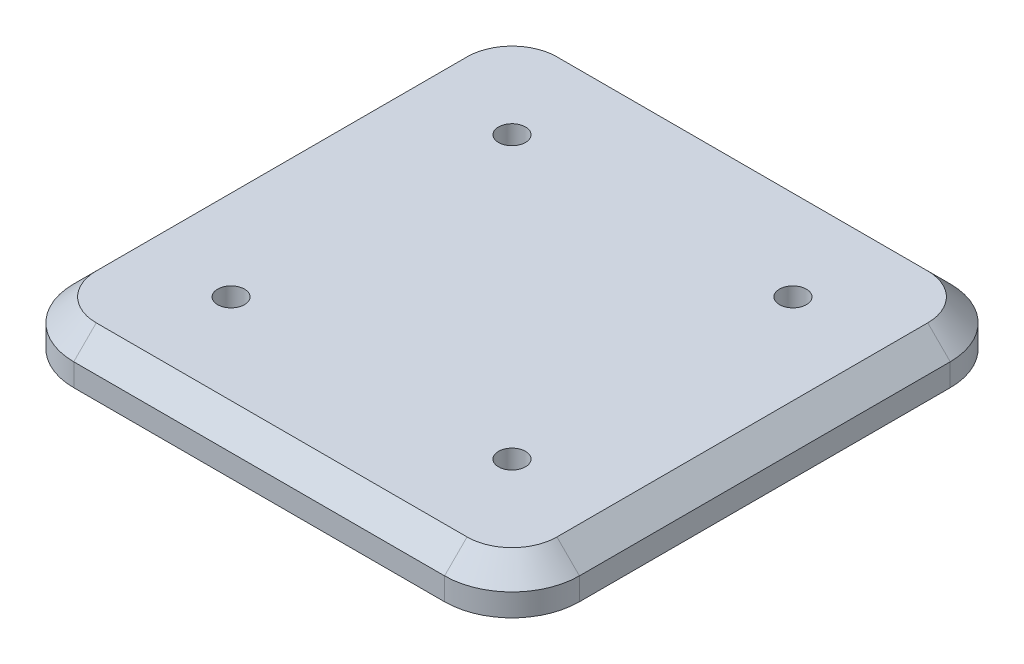
ISO-10303-21;
HEADER;
FILE_DESCRIPTION(('STEP AP214'),'2;1');
FILE_NAME('part.step','',(''),(''),'','','');
FILE_SCHEMA(('AUTOMOTIVE_DESIGN { 1 0 10303 214 1 1 1 1 }'));
ENDSEC;
DATA;
#1=APPLICATION_CONTEXT('core data for automotive mechanical design processes');
#2=APPLICATION_PROTOCOL_DEFINITION('international standard','automotive_design',2000,#1);
#3=PRODUCT_CONTEXT('',#1,'mechanical');
#4=PRODUCT('Part','Part','',(#3));
#5=PRODUCT_RELATED_PRODUCT_CATEGORY('part','',(#4));
#6=PRODUCT_DEFINITION_FORMATION('','',#4);
#7=PRODUCT_DEFINITION_CONTEXT('part definition',#1,'design');
#8=PRODUCT_DEFINITION('design','',#6,#7);
#9=PRODUCT_DEFINITION_SHAPE('','',#8);
#10=(LENGTH_UNIT() NAMED_UNIT(*) SI_UNIT(.MILLI.,.METRE.));
#11=(NAMED_UNIT(*) PLANE_ANGLE_UNIT() SI_UNIT($,.RADIAN.));
#12=(NAMED_UNIT(*) SI_UNIT($,.STERADIAN.) SOLID_ANGLE_UNIT());
#13=UNCERTAINTY_MEASURE_WITH_UNIT(LENGTH_MEASURE(1.E-05),#10,'distance_accuracy_value','');
#14=(GEOMETRIC_REPRESENTATION_CONTEXT(3) GLOBAL_UNCERTAINTY_ASSIGNED_CONTEXT((#13)) GLOBAL_UNIT_ASSIGNED_CONTEXT((#10,
#11,#12)) REPRESENTATION_CONTEXT('',''));
#15=CARTESIAN_POINT('',(0.,0.,0.));
#16=DIRECTION('',(0.,0.,1.));
#17=DIRECTION('',(1.,0.,0.));
#18=AXIS2_PLACEMENT_3D('',#15,#16,#17);
#19=CARTESIAN_POINT('',(0.,20.,0.));
#20=DIRECTION('',(1.,0.,0.));
#21=DIRECTION('',(0.,0.,-1.));
#22=AXIS2_PLACEMENT_3D('',#19,#20,#21);
#23=PLANE('',#22);
#24=DIRECTION('',(0.,-1.,0.));
#25=VECTOR('',#24,1.);
#26=CARTESIAN_POINT('',(0.,20.,-30.));
#27=LINE('',#26,#25);
#28=CARTESIAN_POINT('',(0.,0.,-30.));
#29=VERTEX_POINT('',#28);
#30=CARTESIAN_POINT('',(0.,10.,-30.));
#31=VERTEX_POINT('',#30);
#32=EDGE_CURVE('E217',#29,#31,#27,.F.);
#33=ORIENTED_EDGE('',*,*,#32,.T.);
#34=DIRECTION('',(0.,0.,-1.));
#35=VECTOR('',#34,1.);
#36=CARTESIAN_POINT('',(0.,10.,0.));
#37=LINE('',#36,#35);
#38=CARTESIAN_POINT('',(0.,10.,-195.));
#39=VERTEX_POINT('',#38);
#40=EDGE_CURVE('E261',#31,#39,#37,.T.);
#41=ORIENTED_EDGE('',*,*,#40,.T.);
#42=DIRECTION('',(0.,-1.,0.));
#43=VECTOR('',#42,1.);
#44=CARTESIAN_POINT('',(0.,20.,-195.));
#45=LINE('',#44,#43);
#46=CARTESIAN_POINT('',(0.,0.,-195.));
#47=VERTEX_POINT('',#46);
#48=EDGE_CURVE('E220',#39,#47,#45,.T.);
#49=ORIENTED_EDGE('',*,*,#48,.T.);
#50=DIRECTION('',(0.,0.,1.));
#51=VECTOR('',#50,1.);
#52=CARTESIAN_POINT('',(0.,0.,0.));
#53=LINE('',#52,#51);
#54=EDGE_CURVE('E205',#47,#29,#53,.T.);
#55=ORIENTED_EDGE('',*,*,#54,.T.);
#56=EDGE_LOOP('',(#33,#41,#49,#55));
#57=FACE_BOUND('',#56,.T.);
#58=ADVANCED_FACE('F35',(#57),#23,.F.);
#59=CARTESIAN_POINT('',(0.,20.,0.));
#60=DIRECTION('',(0.,0.,-1.));
#61=DIRECTION('',(-1.,0.,0.));
#62=AXIS2_PLACEMENT_3D('',#59,#60,#61);
#63=PLANE('',#62);
#64=DIRECTION('',(0.,-1.,0.));
#65=VECTOR('',#64,1.);
#66=CARTESIAN_POINT('',(195.,20.,0.));
#67=LINE('',#66,#65);
#68=CARTESIAN_POINT('',(195.,0.,0.));
#69=VERTEX_POINT('',#68);
#70=CARTESIAN_POINT('',(195.,10.,0.));
#71=VERTEX_POINT('',#70);
#72=EDGE_CURVE('E241',#69,#71,#67,.F.);
#73=ORIENTED_EDGE('',*,*,#72,.T.);
#74=DIRECTION('',(-1.,0.,0.));
#75=VECTOR('',#74,1.);
#76=CARTESIAN_POINT('',(0.,10.,0.));
#77=LINE('',#76,#75);
#78=CARTESIAN_POINT('',(30.,10.,0.));
#79=VERTEX_POINT('',#78);
#80=EDGE_CURVE('E268',#71,#79,#77,.T.);
#81=ORIENTED_EDGE('',*,*,#80,.T.);
#82=DIRECTION('',(0.,-1.,0.));
#83=VECTOR('',#82,1.);
#84=CARTESIAN_POINT('',(30.,20.,0.));
#85=LINE('',#84,#83);
#86=CARTESIAN_POINT('',(30.,0.,0.));
#87=VERTEX_POINT('',#86);
#88=EDGE_CURVE('E239',#79,#87,#85,.T.);
#89=ORIENTED_EDGE('',*,*,#88,.T.);
#90=DIRECTION('',(1.,0.,0.));
#91=VECTOR('',#90,1.);
#92=CARTESIAN_POINT('',(0.,0.,0.));
#93=LINE('',#92,#91);
#94=EDGE_CURVE('E208',#87,#69,#93,.T.);
#95=ORIENTED_EDGE('',*,*,#94,.T.);
#96=EDGE_LOOP('',(#73,#81,#89,#95));
#97=FACE_BOUND('',#96,.T.);
#98=ADVANCED_FACE('F311',(#97),#63,.F.);
#99=CARTESIAN_POINT('',(225.,20.,0.));
#100=DIRECTION('',(-1.,0.,0.));
#101=DIRECTION('',(0.,0.,1.));
#102=AXIS2_PLACEMENT_3D('',#99,#100,#101);
#103=PLANE('',#102);
#104=DIRECTION('',(0.,-1.,0.));
#105=VECTOR('',#104,1.);
#106=CARTESIAN_POINT('',(225.,20.,-195.));
#107=LINE('',#106,#105);
#108=CARTESIAN_POINT('',(225.,0.,-195.));
#109=VERTEX_POINT('',#108);
#110=CARTESIAN_POINT('',(225.,10.,-195.));
#111=VERTEX_POINT('',#110);
#112=EDGE_CURVE('E237',#109,#111,#107,.F.);
#113=ORIENTED_EDGE('',*,*,#112,.T.);
#114=DIRECTION('',(0.,0.,1.));
#115=VECTOR('',#114,1.);
#116=CARTESIAN_POINT('',(225.,10.,0.));
#117=LINE('',#116,#115);
#118=CARTESIAN_POINT('',(225.,10.,-30.));
#119=VERTEX_POINT('',#118);
#120=EDGE_CURVE('E11',#111,#119,#117,.T.);
#121=ORIENTED_EDGE('',*,*,#120,.T.);
#122=DIRECTION('',(0.,-1.,0.));
#123=VECTOR('',#122,1.);
#124=CARTESIAN_POINT('',(225.,20.,-30.));
#125=LINE('',#124,#123);
#126=CARTESIAN_POINT('',(225.,0.,-30.));
#127=VERTEX_POINT('',#126);
#128=EDGE_CURVE('E235',#119,#127,#125,.T.);
#129=ORIENTED_EDGE('',*,*,#128,.T.);
#130=DIRECTION('',(0.,0.,-1.));
#131=VECTOR('',#130,1.);
#132=CARTESIAN_POINT('',(225.,0.,0.));
#133=LINE('',#132,#131);
#134=EDGE_CURVE('E211',#127,#109,#133,.T.);
#135=ORIENTED_EDGE('',*,*,#134,.T.);
#136=EDGE_LOOP('',(#113,#121,#129,#135));
#137=FACE_BOUND('',#136,.T.);
#138=ADVANCED_FACE('F321',(#137),#103,.F.);
#139=CARTESIAN_POINT('',(0.,20.,-225.));
#140=DIRECTION('',(0.,0.,1.));
#141=DIRECTION('',(1.,0.,0.));
#142=AXIS2_PLACEMENT_3D('',#139,#140,#141);
#143=PLANE('',#142);
#144=DIRECTION('',(0.,-1.,0.));
#145=VECTOR('',#144,1.);
#146=CARTESIAN_POINT('',(30.,20.,-225.));
#147=LINE('',#146,#145);
#148=CARTESIAN_POINT('',(30.,0.,-225.));
#149=VERTEX_POINT('',#148);
#150=CARTESIAN_POINT('',(30.,10.,-225.));
#151=VERTEX_POINT('',#150);
#152=EDGE_CURVE('E232',#149,#151,#147,.F.);
#153=ORIENTED_EDGE('',*,*,#152,.T.);
#154=DIRECTION('',(1.,0.,0.));
#155=VECTOR('',#154,1.);
#156=CARTESIAN_POINT('',(0.,10.,-225.));
#157=LINE('',#156,#155);
#158=CARTESIAN_POINT('',(195.,10.,-225.));
#159=VERTEX_POINT('',#158);
#160=EDGE_CURVE('E270',#151,#159,#157,.T.);
#161=ORIENTED_EDGE('',*,*,#160,.T.);
#162=DIRECTION('',(0.,-1.,0.));
#163=VECTOR('',#162,1.);
#164=CARTESIAN_POINT('',(195.,20.,-225.));
#165=LINE('',#164,#163);
#166=CARTESIAN_POINT('',(195.,0.,-225.));
#167=VERTEX_POINT('',#166);
#168=EDGE_CURVE('E230',#159,#167,#165,.T.);
#169=ORIENTED_EDGE('',*,*,#168,.T.);
#170=DIRECTION('',(-1.,0.,0.));
#171=VECTOR('',#170,1.);
#172=CARTESIAN_POINT('',(0.,0.,-225.));
#173=LINE('',#172,#171);
#174=EDGE_CURVE('E214',#167,#149,#173,.T.);
#175=ORIENTED_EDGE('',*,*,#174,.T.);
#176=EDGE_LOOP('',(#153,#161,#169,#175));
#177=FACE_BOUND('',#176,.T.);
#178=ADVANCED_FACE('F326',(#177),#143,.F.);
#179=CARTESIAN_POINT('',(0.,20.,0.));
#180=DIRECTION('',(0.,-1.,0.));
#181=DIRECTION('',(0.,0.,-1.));
#182=AXIS2_PLACEMENT_3D('',#179,#180,#181);
#183=PLANE('',#182);
#184=CARTESIAN_POINT('',(50.,20.,-50.));
#185=DIRECTION('',(0.,1.,0.));
#186=DIRECTION('',(0.,0.,1.));
#187=AXIS2_PLACEMENT_3D('',#184,#185,#186);
#188=CIRCLE('',#187,5.99999999999999);
#189=CARTESIAN_POINT('',(50.,20.,-44.));
#190=VERTEX_POINT('',#189);
#191=EDGE_CURVE('E158',#190,#190,#188,.T.);
#192=ORIENTED_EDGE('',*,*,#191,.F.);
#193=EDGE_LOOP('',(#192));
#194=FACE_BOUND('',#193,.T.);
#195=CARTESIAN_POINT('',(50.,20.,-175.));
#196=DIRECTION('',(0.,1.,0.));
#197=DIRECTION('',(0.,0.,1.));
#198=AXIS2_PLACEMENT_3D('',#195,#196,#197);
#199=CIRCLE('',#198,5.99999999999999);
#200=CARTESIAN_POINT('',(50.,20.,-169.));
#201=VERTEX_POINT('',#200);
#202=EDGE_CURVE('E157',#201,#201,#199,.T.);
#203=ORIENTED_EDGE('',*,*,#202,.F.);
#204=EDGE_LOOP('',(#203));
#205=FACE_BOUND('',#204,.T.);
#206=CARTESIAN_POINT('',(175.,20.,-175.));
#207=DIRECTION('',(0.,1.,0.));
#208=DIRECTION('',(0.,0.,1.));
#209=AXIS2_PLACEMENT_3D('',#206,#207,#208);
#210=CIRCLE('',#209,5.99999999999998);
#211=CARTESIAN_POINT('',(175.,20.,-169.));
#212=VERTEX_POINT('',#211);
#213=EDGE_CURVE('E168',#212,#212,#210,.T.);
#214=ORIENTED_EDGE('',*,*,#213,.F.);
#215=EDGE_LOOP('',(#214));
#216=FACE_BOUND('',#215,.T.);
#217=CARTESIAN_POINT('',(175.,20.,-50.));
#218=DIRECTION('',(0.,1.,0.));
#219=DIRECTION('',(0.,0.,1.));
#220=AXIS2_PLACEMENT_3D('',#217,#218,#219);
#221=CIRCLE('',#220,5.99999999999998);
#222=CARTESIAN_POINT('',(175.,20.,-44.));
#223=VERTEX_POINT('',#222);
#224=EDGE_CURVE('E174',#223,#223,#221,.T.);
#225=ORIENTED_EDGE('',*,*,#224,.F.);
#226=EDGE_LOOP('',(#225));
#227=FACE_BOUND('',#226,.T.);
#228=CARTESIAN_POINT('',(30.,20.,-195.));
#229=DIRECTION('',(0.,-1.,0.));
#230=DIRECTION('',(0.,0.,-1.));
#231=AXIS2_PLACEMENT_3D('',#228,#229,#230);
#232=CIRCLE('',#231,20.);
#233=CARTESIAN_POINT('',(30.,20.,-215.));
#234=VERTEX_POINT('',#233);
#235=CARTESIAN_POINT('',(9.99999999999995,20.,-195.));
#236=VERTEX_POINT('',#235);
#237=EDGE_CURVE('E254',#234,#236,#232,.F.);
#238=ORIENTED_EDGE('',*,*,#237,.T.);
#239=DIRECTION('',(0.,0.,1.));
#240=VECTOR('',#239,1.);
#241=CARTESIAN_POINT('',(9.99999999999995,20.,0.));
#242=LINE('',#241,#240);
#243=CARTESIAN_POINT('',(9.99999999999995,20.,-30.));
#244=VERTEX_POINT('',#243);
#245=EDGE_CURVE('E258',#236,#244,#242,.T.);
#246=ORIENTED_EDGE('',*,*,#245,.T.);
#247=CARTESIAN_POINT('',(30.,20.,-30.));
#248=DIRECTION('',(0.,-1.,0.));
#249=DIRECTION('',(0.,0.,-1.));
#250=AXIS2_PLACEMENT_3D('',#247,#248,#249);
#251=CIRCLE('',#250,20.);
#252=CARTESIAN_POINT('',(30.,20.,-9.99999999999995));
#253=VERTEX_POINT('',#252);
#254=EDGE_CURVE('E256',#244,#253,#251,.F.);
#255=ORIENTED_EDGE('',*,*,#254,.T.);
#256=DIRECTION('',(1.,0.,0.));
#257=VECTOR('',#256,1.);
#258=CARTESIAN_POINT('',(0.,20.,-9.99999999999995));
#259=LINE('',#258,#257);
#260=CARTESIAN_POINT('',(195.,20.,-9.99999999999995));
#261=VERTEX_POINT('',#260);
#262=EDGE_CURVE('E252',#253,#261,#259,.T.);
#263=ORIENTED_EDGE('',*,*,#262,.T.);
#264=CARTESIAN_POINT('',(195.,20.,-30.));
#265=DIRECTION('',(0.,-1.,0.));
#266=DIRECTION('',(0.,0.,-1.));
#267=AXIS2_PLACEMENT_3D('',#264,#265,#266);
#268=CIRCLE('',#267,20.);
#269=CARTESIAN_POINT('',(215.,20.,-30.));
#270=VERTEX_POINT('',#269);
#271=EDGE_CURVE('E248',#261,#270,#268,.F.);
#272=ORIENTED_EDGE('',*,*,#271,.T.);
#273=DIRECTION('',(0.,0.,-1.));
#274=VECTOR('',#273,1.);
#275=CARTESIAN_POINT('',(215.,20.,0.));
#276=LINE('',#275,#274);
#277=CARTESIAN_POINT('',(215.,20.,-195.));
#278=VERTEX_POINT('',#277);
#279=EDGE_CURVE('E244',#270,#278,#276,.T.);
#280=ORIENTED_EDGE('',*,*,#279,.T.);
#281=CARTESIAN_POINT('',(195.,20.,-195.));
#282=DIRECTION('',(0.,-1.,0.));
#283=DIRECTION('',(0.,0.,-1.));
#284=AXIS2_PLACEMENT_3D('',#281,#282,#283);
#285=CIRCLE('',#284,20.);
#286=CARTESIAN_POINT('',(195.,20.,-215.));
#287=VERTEX_POINT('',#286);
#288=EDGE_CURVE('E246',#278,#287,#285,.F.);
#289=ORIENTED_EDGE('',*,*,#288,.T.);
#290=DIRECTION('',(-1.,0.,0.));
#291=VECTOR('',#290,1.);
#292=CARTESIAN_POINT('',(0.,20.,-215.));
#293=LINE('',#292,#291);
#294=EDGE_CURVE('E250',#287,#234,#293,.T.);
#295=ORIENTED_EDGE('',*,*,#294,.T.);
#296=EDGE_LOOP('',(#238,#246,#255,#263,#272,#280,#289,#295));
#297=FACE_BOUND('',#296,.T.);
#298=ADVANCED_FACE('F351',(#194,#205,#216,#227,#297),#183,.F.);
#299=CARTESIAN_POINT('',(0.,0.,0.));
#300=DIRECTION('',(0.,-1.,0.));
#301=DIRECTION('',(0.,0.,-1.));
#302=AXIS2_PLACEMENT_3D('',#299,#300,#301);
#303=PLANE('',#302);
#304=CARTESIAN_POINT('',(25.,0.,-25.));
#305=DIRECTION('',(0.,-1.,0.));
#306=DIRECTION('',(0.,0.,-1.));
#307=AXIS2_PLACEMENT_3D('',#304,#305,#306);
#308=CIRCLE('',#307,5.99999999999999);
#309=CARTESIAN_POINT('',(25.,0.,-31.));
#310=VERTEX_POINT('',#309);
#311=EDGE_CURVE('E180',#310,#310,#308,.T.);
#312=ORIENTED_EDGE('',*,*,#311,.F.);
#313=EDGE_LOOP('',(#312));
#314=FACE_BOUND('',#313,.T.);
#315=CARTESIAN_POINT('',(200.,0.,-25.));
#316=DIRECTION('',(0.,-1.,0.));
#317=DIRECTION('',(0.,0.,-1.));
#318=AXIS2_PLACEMENT_3D('',#315,#316,#317);
#319=CIRCLE('',#318,5.99999999999998);
#320=CARTESIAN_POINT('',(200.,0.,-31.));
#321=VERTEX_POINT('',#320);
#322=EDGE_CURVE('E186',#321,#321,#319,.T.);
#323=ORIENTED_EDGE('',*,*,#322,.F.);
#324=EDGE_LOOP('',(#323));
#325=FACE_BOUND('',#324,.T.);
#326=CARTESIAN_POINT('',(200.,0.,-200.));
#327=DIRECTION('',(0.,-1.,0.));
#328=DIRECTION('',(0.,0.,-1.));
#329=AXIS2_PLACEMENT_3D('',#326,#327,#328);
#330=CIRCLE('',#329,5.99999999999998);
#331=CARTESIAN_POINT('',(200.,0.,-206.));
#332=VERTEX_POINT('',#331);
#333=EDGE_CURVE('E192',#332,#332,#330,.T.);
#334=ORIENTED_EDGE('',*,*,#333,.F.);
#335=EDGE_LOOP('',(#334));
#336=FACE_BOUND('',#335,.T.);
#337=CARTESIAN_POINT('',(25.,0.,-200.));
#338=DIRECTION('',(0.,-1.,0.));
#339=DIRECTION('',(0.,0.,-1.));
#340=AXIS2_PLACEMENT_3D('',#337,#338,#339);
#341=CIRCLE('',#340,5.99999999999999);
#342=CARTESIAN_POINT('',(25.,0.,-206.));
#343=VERTEX_POINT('',#342);
#344=EDGE_CURVE('E198',#343,#343,#341,.T.);
#345=ORIENTED_EDGE('',*,*,#344,.F.);
#346=EDGE_LOOP('',(#345));
#347=FACE_BOUND('',#346,.T.);
#348=ORIENTED_EDGE('',*,*,#54,.F.);
#349=CARTESIAN_POINT('',(30.,0.,-195.));
#350=DIRECTION('',(0.,-1.,0.));
#351=DIRECTION('',(0.,0.,-1.));
#352=AXIS2_PLACEMENT_3D('',#349,#350,#351);
#353=CIRCLE('',#352,30.);
#354=EDGE_CURVE('E228',#47,#149,#353,.T.);
#355=ORIENTED_EDGE('',*,*,#354,.T.);
#356=ORIENTED_EDGE('',*,*,#174,.F.);
#357=CARTESIAN_POINT('',(195.,0.,-195.));
#358=DIRECTION('',(0.,-1.,0.));
#359=DIRECTION('',(0.,0.,-1.));
#360=AXIS2_PLACEMENT_3D('',#357,#358,#359);
#361=CIRCLE('',#360,30.);
#362=EDGE_CURVE('E226',#167,#109,#361,.T.);
#363=ORIENTED_EDGE('',*,*,#362,.T.);
#364=ORIENTED_EDGE('',*,*,#134,.F.);
#365=CARTESIAN_POINT('',(195.,0.,-30.));
#366=DIRECTION('',(0.,-1.,0.));
#367=DIRECTION('',(0.,0.,-1.));
#368=AXIS2_PLACEMENT_3D('',#365,#366,#367);
#369=CIRCLE('',#368,30.);
#370=EDGE_CURVE('E224',#127,#69,#369,.T.);
#371=ORIENTED_EDGE('',*,*,#370,.T.);
#372=ORIENTED_EDGE('',*,*,#94,.F.);
#373=CARTESIAN_POINT('',(30.,0.,-30.));
#374=DIRECTION('',(0.,-1.,0.));
#375=DIRECTION('',(0.,0.,-1.));
#376=AXIS2_PLACEMENT_3D('',#373,#374,#375);
#377=CIRCLE('',#376,30.);
#378=EDGE_CURVE('E222',#87,#29,#377,.T.);
#379=ORIENTED_EDGE('',*,*,#378,.T.);
#380=EDGE_LOOP('',(#348,#355,#356,#363,#364,#371,#372,#379));
#381=FACE_BOUND('',#380,.T.);
#382=ADVANCED_FACE('F317',(#314,#325,#336,#347,#381),#303,.T.);
#383=CARTESIAN_POINT('',(30.,20.,-195.));
#384=DIRECTION('',(0.,-1.,0.));
#385=DIRECTION('',(0.,0.,-1.));
#386=AXIS2_PLACEMENT_3D('',#383,#384,#385);
#387=CYLINDRICAL_SURFACE('',#386,30.);
#388=ORIENTED_EDGE('',*,*,#48,.F.);
#389=CARTESIAN_POINT('',(30.,10.,-195.));
#390=DIRECTION('',(0.,-1.,0.));
#391=DIRECTION('',(0.,0.,-1.));
#392=AXIS2_PLACEMENT_3D('',#389,#390,#391);
#393=CIRCLE('',#392,30.);
#394=EDGE_CURVE('E266',#39,#151,#393,.T.);
#395=ORIENTED_EDGE('',*,*,#394,.T.);
#396=ORIENTED_EDGE('',*,*,#152,.F.);
#397=ORIENTED_EDGE('',*,*,#354,.F.);
#398=EDGE_LOOP('',(#388,#395,#396,#397));
#399=FACE_BOUND('',#398,.T.);
#400=ADVANCED_FACE('F330',(#399),#387,.T.);
#401=CARTESIAN_POINT('',(195.,20.,-195.));
#402=DIRECTION('',(0.,-1.,0.));
#403=DIRECTION('',(0.,0.,-1.));
#404=AXIS2_PLACEMENT_3D('',#401,#402,#403);
#405=CYLINDRICAL_SURFACE('',#404,30.);
#406=ORIENTED_EDGE('',*,*,#168,.F.);
#407=CARTESIAN_POINT('',(195.,10.,-195.));
#408=DIRECTION('',(0.,-1.,0.));
#409=DIRECTION('',(0.,0.,-1.));
#410=AXIS2_PLACEMENT_3D('',#407,#408,#409);
#411=CIRCLE('',#410,30.);
#412=EDGE_CURVE('E44',#159,#111,#411,.T.);
#413=ORIENTED_EDGE('',*,*,#412,.T.);
#414=ORIENTED_EDGE('',*,*,#112,.F.);
#415=ORIENTED_EDGE('',*,*,#362,.F.);
#416=EDGE_LOOP('',(#406,#413,#414,#415));
#417=FACE_BOUND('',#416,.T.);
#418=ADVANCED_FACE('F322',(#417),#405,.T.);
#419=CARTESIAN_POINT('',(195.,20.,-30.));
#420=DIRECTION('',(0.,-1.,0.));
#421=DIRECTION('',(0.,0.,-1.));
#422=AXIS2_PLACEMENT_3D('',#419,#420,#421);
#423=CYLINDRICAL_SURFACE('',#422,30.);
#424=ORIENTED_EDGE('',*,*,#128,.F.);
#425=CARTESIAN_POINT('',(195.,10.,-30.));
#426=DIRECTION('',(0.,-1.,0.));
#427=DIRECTION('',(0.,0.,-1.));
#428=AXIS2_PLACEMENT_3D('',#425,#426,#427);
#429=CIRCLE('',#428,30.);
#430=EDGE_CURVE('E272',#119,#71,#429,.T.);
#431=ORIENTED_EDGE('',*,*,#430,.T.);
#432=ORIENTED_EDGE('',*,*,#72,.F.);
#433=ORIENTED_EDGE('',*,*,#370,.F.);
#434=EDGE_LOOP('',(#424,#431,#432,#433));
#435=FACE_BOUND('',#434,.T.);
#436=ADVANCED_FACE('F308',(#435),#423,.T.);
#437=CARTESIAN_POINT('',(30.,20.,-30.));
#438=DIRECTION('',(0.,-1.,0.));
#439=DIRECTION('',(0.,0.,-1.));
#440=AXIS2_PLACEMENT_3D('',#437,#438,#439);
#441=CYLINDRICAL_SURFACE('',#440,30.);
#442=ORIENTED_EDGE('',*,*,#88,.F.);
#443=CARTESIAN_POINT('',(30.,10.,-30.));
#444=DIRECTION('',(0.,-1.,0.));
#445=DIRECTION('',(0.,0.,-1.));
#446=AXIS2_PLACEMENT_3D('',#443,#444,#445);
#447=CIRCLE('',#446,30.);
#448=EDGE_CURVE('E264',#79,#31,#447,.T.);
#449=ORIENTED_EDGE('',*,*,#448,.T.);
#450=ORIENTED_EDGE('',*,*,#32,.F.);
#451=ORIENTED_EDGE('',*,*,#378,.F.);
#452=EDGE_LOOP('',(#442,#449,#450,#451));
#453=FACE_BOUND('',#452,.T.);
#454=ADVANCED_FACE('F379',(#453),#441,.T.);
#455=CARTESIAN_POINT('',(215.,20.,0.));
#456=DIRECTION('',(-0.707106781186548,-0.707106781186547,0.));
#457=DIRECTION('',(0.,0.,-1.));
#458=AXIS2_PLACEMENT_3D('',#455,#456,#457);
#459=PLANE('',#458);
#460=DIRECTION('',(-0.707106781186547,0.707106781186548,0.));
#461=VECTOR('',#460,1.);
#462=CARTESIAN_POINT('',(225.,10.,-30.));
#463=LINE('',#462,#461);
#464=EDGE_CURVE('E289',#119,#270,#463,.T.);
#465=ORIENTED_EDGE('',*,*,#464,.F.);
#466=ORIENTED_EDGE('',*,*,#120,.F.);
#467=DIRECTION('',(0.707106781186547,-0.707106781186548,0.));
#468=VECTOR('',#467,1.);
#469=CARTESIAN_POINT('',(215.,20.,-195.));
#470=LINE('',#469,#468);
#471=EDGE_CURVE('E39',#278,#111,#470,.T.);
#472=ORIENTED_EDGE('',*,*,#471,.F.);
#473=ORIENTED_EDGE('',*,*,#279,.F.);
#474=EDGE_LOOP('',(#465,#466,#472,#473));
#475=FACE_BOUND('',#474,.T.);
#476=ADVANCED_FACE('F37',(#475),#459,.F.);
#477=CARTESIAN_POINT('',(195.,20.,-195.));
#478=DIRECTION('',(0.,-1.,0.));
#479=DIRECTION('',(0.,0.,-1.));
#480=AXIS2_PLACEMENT_3D('',#477,#478,#479);
#481=CONICAL_SURFACE('',#480,20.,0.785398163397447);
#482=ORIENTED_EDGE('',*,*,#471,.T.);
#483=ORIENTED_EDGE('',*,*,#412,.F.);
#484=DIRECTION('',(0.,-0.707106781186548,-0.707106781186547));
#485=VECTOR('',#484,1.);
#486=CARTESIAN_POINT('',(195.,20.,-215.));
#487=LINE('',#486,#485);
#488=EDGE_CURVE('E287',#287,#159,#487,.T.);
#489=ORIENTED_EDGE('',*,*,#488,.F.);
#490=ORIENTED_EDGE('',*,*,#288,.F.);
#491=EDGE_LOOP('',(#482,#483,#489,#490));
#492=FACE_BOUND('',#491,.T.);
#493=ADVANCED_FACE('F299',(#492),#481,.T.);
#494=CARTESIAN_POINT('',(195.,20.,-30.));
#495=DIRECTION('',(0.,-1.,0.));
#496=DIRECTION('',(0.,0.,-1.));
#497=AXIS2_PLACEMENT_3D('',#494,#495,#496);
#498=CONICAL_SURFACE('',#497,20.,0.785398163397447);
#499=ORIENTED_EDGE('',*,*,#464,.T.);
#500=ORIENTED_EDGE('',*,*,#271,.F.);
#501=DIRECTION('',(0.,0.707106781186548,-0.707106781186547));
#502=VECTOR('',#501,1.);
#503=CARTESIAN_POINT('',(195.,10.,0.));
#504=LINE('',#503,#502);
#505=EDGE_CURVE('E284',#71,#261,#504,.T.);
#506=ORIENTED_EDGE('',*,*,#505,.F.);
#507=ORIENTED_EDGE('',*,*,#430,.F.);
#508=EDGE_LOOP('',(#499,#500,#506,#507));
#509=FACE_BOUND('',#508,.T.);
#510=ADVANCED_FACE('F304',(#509),#498,.T.);
#511=CARTESIAN_POINT('',(0.,20.,-215.));
#512=DIRECTION('',(0.,-0.707106781186547,0.707106781186548));
#513=DIRECTION('',(-1.,0.,0.));
#514=AXIS2_PLACEMENT_3D('',#511,#512,#513);
#515=PLANE('',#514);
#516=ORIENTED_EDGE('',*,*,#488,.T.);
#517=ORIENTED_EDGE('',*,*,#160,.F.);
#518=DIRECTION('',(0.,-0.707106781186548,-0.707106781186547));
#519=VECTOR('',#518,1.);
#520=CARTESIAN_POINT('',(30.,20.,-215.));
#521=LINE('',#520,#519);
#522=EDGE_CURVE('E281',#234,#151,#521,.T.);
#523=ORIENTED_EDGE('',*,*,#522,.F.);
#524=ORIENTED_EDGE('',*,*,#294,.F.);
#525=EDGE_LOOP('',(#516,#517,#523,#524));
#526=FACE_BOUND('',#525,.T.);
#527=ADVANCED_FACE('F354',(#526),#515,.F.);
#528=CARTESIAN_POINT('',(0.,20.,-9.99999999999995));
#529=DIRECTION('',(0.,-0.707106781186547,-0.707106781186548));
#530=DIRECTION('',(1.,0.,0.));
#531=AXIS2_PLACEMENT_3D('',#528,#529,#530);
#532=PLANE('',#531);
#533=ORIENTED_EDGE('',*,*,#505,.T.);
#534=ORIENTED_EDGE('',*,*,#262,.F.);
#535=DIRECTION('',(0.,0.707106781186548,-0.707106781186547));
#536=VECTOR('',#535,1.);
#537=CARTESIAN_POINT('',(30.,10.,0.));
#538=LINE('',#537,#536);
#539=EDGE_CURVE('E278',#79,#253,#538,.T.);
#540=ORIENTED_EDGE('',*,*,#539,.F.);
#541=ORIENTED_EDGE('',*,*,#80,.F.);
#542=EDGE_LOOP('',(#533,#534,#540,#541));
#543=FACE_BOUND('',#542,.T.);
#544=ADVANCED_FACE('F356',(#543),#532,.F.);
#545=CARTESIAN_POINT('',(30.,20.,-195.));
#546=DIRECTION('',(0.,-1.,0.));
#547=DIRECTION('',(0.,0.,-1.));
#548=AXIS2_PLACEMENT_3D('',#545,#546,#547);
#549=CONICAL_SURFACE('',#548,20.,0.785398163397447);
#550=ORIENTED_EDGE('',*,*,#522,.T.);
#551=ORIENTED_EDGE('',*,*,#394,.F.);
#552=DIRECTION('',(-0.707106781186547,-0.707106781186548,0.));
#553=VECTOR('',#552,1.);
#554=CARTESIAN_POINT('',(9.99999999999995,20.,-195.));
#555=LINE('',#554,#553);
#556=EDGE_CURVE('E276',#236,#39,#555,.T.);
#557=ORIENTED_EDGE('',*,*,#556,.F.);
#558=ORIENTED_EDGE('',*,*,#237,.F.);
#559=EDGE_LOOP('',(#550,#551,#557,#558));
#560=FACE_BOUND('',#559,.T.);
#561=ADVANCED_FACE('F334',(#560),#549,.T.);
#562=CARTESIAN_POINT('',(30.,20.,-30.));
#563=DIRECTION('',(0.,-1.,0.));
#564=DIRECTION('',(0.,0.,-1.));
#565=AXIS2_PLACEMENT_3D('',#562,#563,#564);
#566=CONICAL_SURFACE('',#565,20.,0.785398163397447);
#567=ORIENTED_EDGE('',*,*,#539,.T.);
#568=ORIENTED_EDGE('',*,*,#254,.F.);
#569=DIRECTION('',(0.707106781186547,0.707106781186548,0.));
#570=VECTOR('',#569,1.);
#571=CARTESIAN_POINT('',(0.,10.,-30.));
#572=LINE('',#571,#570);
#573=EDGE_CURVE('E204',#31,#244,#572,.T.);
#574=ORIENTED_EDGE('',*,*,#573,.F.);
#575=ORIENTED_EDGE('',*,*,#448,.F.);
#576=EDGE_LOOP('',(#567,#568,#574,#575));
#577=FACE_BOUND('',#576,.T.);
#578=ADVANCED_FACE('F347',(#577),#566,.T.);
#579=CARTESIAN_POINT('',(9.99999999999995,20.,0.));
#580=DIRECTION('',(0.707106781186548,-0.707106781186547,0.));
#581=DIRECTION('',(0.,0.,1.));
#582=AXIS2_PLACEMENT_3D('',#579,#580,#581);
#583=PLANE('',#582);
#584=ORIENTED_EDGE('',*,*,#556,.T.);
#585=ORIENTED_EDGE('',*,*,#40,.F.);
#586=ORIENTED_EDGE('',*,*,#573,.T.);
#587=ORIENTED_EDGE('',*,*,#245,.F.);
#588=EDGE_LOOP('',(#584,#585,#586,#587));
#589=FACE_BOUND('',#588,.T.);
#590=ADVANCED_FACE('F343',(#589),#583,.F.);
#591=CARTESIAN_POINT('',(25.,9.99999999999999,-200.));
#592=DIRECTION('',(0.,-1.,0.));
#593=DIRECTION('',(0.,0.,-1.));
#594=AXIS2_PLACEMENT_3D('',#591,#592,#593);
#595=CONICAL_SURFACE('',#594,5.99999999999999,1.02974425867666);
#596=CARTESIAN_POINT('',(25.,13.6051637141653,-200.));
#597=VERTEX_POINT('',#596);
#598=VERTEX_LOOP('',#597);
#599=FACE_BOUND('',#598,.T.);
#600=CARTESIAN_POINT('',(25.,9.99999999999999,-200.));
#601=DIRECTION('',(0.,-1.,0.));
#602=DIRECTION('',(0.,0.,-1.));
#603=AXIS2_PLACEMENT_3D('',#600,#601,#602);
#604=CIRCLE('',#603,5.99999999999999);
#605=CARTESIAN_POINT('',(25.,9.99999999999999,-206.));
#606=VERTEX_POINT('',#605);
#607=EDGE_CURVE('E201',#606,#606,#604,.T.);
#608=ORIENTED_EDGE('',*,*,#607,.T.);
#609=EDGE_LOOP('',(#608));
#610=FACE_BOUND('',#609,.T.);
#611=ADVANCED_FACE('F385',(#599,#610),#595,.F.);
#612=CARTESIAN_POINT('',(25.,0.,-200.));
#613=DIRECTION('',(0.,-1.,0.));
#614=DIRECTION('',(0.,0.,-1.));
#615=AXIS2_PLACEMENT_3D('',#612,#613,#614);
#616=CYLINDRICAL_SURFACE('',#615,5.99999999999999);
#617=ORIENTED_EDGE('',*,*,#607,.F.);
#618=EDGE_LOOP('',(#617));
#619=FACE_BOUND('',#618,.T.);
#620=ORIENTED_EDGE('',*,*,#344,.T.);
#621=EDGE_LOOP('',(#620));
#622=FACE_BOUND('',#621,.T.);
#623=ADVANCED_FACE('F408',(#619,#622),#616,.F.);
#624=CARTESIAN_POINT('',(200.,9.99999999999999,-200.));
#625=DIRECTION('',(0.,-1.,0.));
#626=DIRECTION('',(0.,0.,-1.));
#627=AXIS2_PLACEMENT_3D('',#624,#625,#626);
#628=CONICAL_SURFACE('',#627,5.99999999999998,1.02974425867665);
#629=CARTESIAN_POINT('',(200.,13.6051637141653,-200.));
#630=VERTEX_POINT('',#629);
#631=VERTEX_LOOP('',#630);
#632=FACE_BOUND('',#631,.T.);
#633=CARTESIAN_POINT('',(200.,9.99999999999999,-200.));
#634=DIRECTION('',(0.,-1.,0.));
#635=DIRECTION('',(0.,0.,-1.));
#636=AXIS2_PLACEMENT_3D('',#633,#634,#635);
#637=CIRCLE('',#636,5.99999999999998);
#638=CARTESIAN_POINT('',(200.,9.99999999999999,-206.));
#639=VERTEX_POINT('',#638);
#640=EDGE_CURVE('E195',#639,#639,#637,.T.);
#641=ORIENTED_EDGE('',*,*,#640,.T.);
#642=EDGE_LOOP('',(#641));
#643=FACE_BOUND('',#642,.T.);
#644=ADVANCED_FACE('F417',(#632,#643),#628,.F.);
#645=CARTESIAN_POINT('',(200.,0.,-200.));
#646=DIRECTION('',(0.,-1.,0.));
#647=DIRECTION('',(0.,0.,-1.));
#648=AXIS2_PLACEMENT_3D('',#645,#646,#647);
#649=CYLINDRICAL_SURFACE('',#648,5.99999999999998);
#650=ORIENTED_EDGE('',*,*,#640,.F.);
#651=EDGE_LOOP('',(#650));
#652=FACE_BOUND('',#651,.T.);
#653=ORIENTED_EDGE('',*,*,#333,.T.);
#654=EDGE_LOOP('',(#653));
#655=FACE_BOUND('',#654,.T.);
#656=ADVANCED_FACE('F425',(#652,#655),#649,.F.);
#657=CARTESIAN_POINT('',(200.,9.99999999999999,-25.));
#658=DIRECTION('',(0.,-1.,0.));
#659=DIRECTION('',(0.,0.,-1.));
#660=AXIS2_PLACEMENT_3D('',#657,#658,#659);
#661=CONICAL_SURFACE('',#660,5.99999999999998,1.02974425867665);
#662=CARTESIAN_POINT('',(200.,13.6051637141653,-25.));
#663=VERTEX_POINT('',#662);
#664=VERTEX_LOOP('',#663);
#665=FACE_BOUND('',#664,.T.);
#666=CARTESIAN_POINT('',(200.,9.99999999999999,-25.));
#667=DIRECTION('',(0.,-1.,0.));
#668=DIRECTION('',(0.,0.,-1.));
#669=AXIS2_PLACEMENT_3D('',#666,#667,#668);
#670=CIRCLE('',#669,5.99999999999998);
#671=CARTESIAN_POINT('',(200.,9.99999999999999,-31.));
#672=VERTEX_POINT('',#671);
#673=EDGE_CURVE('E189',#672,#672,#670,.T.);
#674=ORIENTED_EDGE('',*,*,#673,.T.);
#675=EDGE_LOOP('',(#674));
#676=FACE_BOUND('',#675,.T.);
#677=ADVANCED_FACE('F433',(#665,#676),#661,.F.);
#678=CARTESIAN_POINT('',(200.,0.,-25.));
#679=DIRECTION('',(0.,-1.,0.));
#680=DIRECTION('',(0.,0.,-1.));
#681=AXIS2_PLACEMENT_3D('',#678,#679,#680);
#682=CYLINDRICAL_SURFACE('',#681,5.99999999999998);
#683=ORIENTED_EDGE('',*,*,#673,.F.);
#684=EDGE_LOOP('',(#683));
#685=FACE_BOUND('',#684,.T.);
#686=ORIENTED_EDGE('',*,*,#322,.T.);
#687=EDGE_LOOP('',(#686));
#688=FACE_BOUND('',#687,.T.);
#689=ADVANCED_FACE('F441',(#685,#688),#682,.F.);
#690=CARTESIAN_POINT('',(25.,9.99999999999999,-25.));
#691=DIRECTION('',(0.,-1.,0.));
#692=DIRECTION('',(0.,0.,-1.));
#693=AXIS2_PLACEMENT_3D('',#690,#691,#692);
#694=CONICAL_SURFACE('',#693,5.99999999999999,1.02974425867666);
#695=CARTESIAN_POINT('',(25.,13.6051637141653,-25.));
#696=VERTEX_POINT('',#695);
#697=VERTEX_LOOP('',#696);
#698=FACE_BOUND('',#697,.T.);
#699=CARTESIAN_POINT('',(25.,9.99999999999999,-25.));
#700=DIRECTION('',(0.,-1.,0.));
#701=DIRECTION('',(0.,0.,-1.));
#702=AXIS2_PLACEMENT_3D('',#699,#700,#701);
#703=CIRCLE('',#702,5.99999999999999);
#704=CARTESIAN_POINT('',(25.,9.99999999999999,-31.));
#705=VERTEX_POINT('',#704);
#706=EDGE_CURVE('E183',#705,#705,#703,.T.);
#707=ORIENTED_EDGE('',*,*,#706,.T.);
#708=EDGE_LOOP('',(#707));
#709=FACE_BOUND('',#708,.T.);
#710=ADVANCED_FACE('F449',(#698,#709),#694,.F.);
#711=CARTESIAN_POINT('',(25.,0.,-25.));
#712=DIRECTION('',(0.,-1.,0.));
#713=DIRECTION('',(0.,0.,-1.));
#714=AXIS2_PLACEMENT_3D('',#711,#712,#713);
#715=CYLINDRICAL_SURFACE('',#714,5.99999999999999);
#716=ORIENTED_EDGE('',*,*,#706,.F.);
#717=EDGE_LOOP('',(#716));
#718=FACE_BOUND('',#717,.T.);
#719=ORIENTED_EDGE('',*,*,#311,.T.);
#720=EDGE_LOOP('',(#719));
#721=FACE_BOUND('',#720,.T.);
#722=ADVANCED_FACE('F457',(#718,#721),#715,.F.);
#723=CARTESIAN_POINT('',(175.,10.,-50.));
#724=DIRECTION('',(0.,1.,0.));
#725=DIRECTION('',(0.,0.,1.));
#726=AXIS2_PLACEMENT_3D('',#723,#724,#725);
#727=CONICAL_SURFACE('',#726,5.99999999999998,1.02974425867665);
#728=CARTESIAN_POINT('',(175.,6.39483628583466,-50.));
#729=VERTEX_POINT('',#728);
#730=VERTEX_LOOP('',#729);
#731=FACE_BOUND('',#730,.T.);
#732=CARTESIAN_POINT('',(175.,10.,-50.));
#733=DIRECTION('',(0.,1.,0.));
#734=DIRECTION('',(0.,0.,1.));
#735=AXIS2_PLACEMENT_3D('',#732,#733,#734);
#736=CIRCLE('',#735,5.99999999999998);
#737=CARTESIAN_POINT('',(175.,10.,-44.));
#738=VERTEX_POINT('',#737);
#739=EDGE_CURVE('E177',#738,#738,#736,.T.);
#740=ORIENTED_EDGE('',*,*,#739,.T.);
#741=EDGE_LOOP('',(#740));
#742=FACE_BOUND('',#741,.T.);
#743=ADVANCED_FACE('F465',(#731,#742),#727,.F.);
#744=CARTESIAN_POINT('',(175.,20.,-50.));
#745=DIRECTION('',(0.,1.,0.));
#746=DIRECTION('',(0.,0.,1.));
#747=AXIS2_PLACEMENT_3D('',#744,#745,#746);
#748=CYLINDRICAL_SURFACE('',#747,5.99999999999998);
#749=ORIENTED_EDGE('',*,*,#739,.F.);
#750=EDGE_LOOP('',(#749));
#751=FACE_BOUND('',#750,.T.);
#752=ORIENTED_EDGE('',*,*,#224,.T.);
#753=EDGE_LOOP('',(#752));
#754=FACE_BOUND('',#753,.T.);
#755=ADVANCED_FACE('F473',(#751,#754),#748,.F.);
#756=CARTESIAN_POINT('',(175.,10.,-175.));
#757=DIRECTION('',(0.,1.,0.));
#758=DIRECTION('',(0.,0.,1.));
#759=AXIS2_PLACEMENT_3D('',#756,#757,#758);
#760=CONICAL_SURFACE('',#759,5.99999999999998,1.02974425867665);
#761=CARTESIAN_POINT('',(175.,6.39483628583466,-175.));
#762=VERTEX_POINT('',#761);
#763=VERTEX_LOOP('',#762);
#764=FACE_BOUND('',#763,.T.);
#765=CARTESIAN_POINT('',(175.,10.,-175.));
#766=DIRECTION('',(0.,1.,0.));
#767=DIRECTION('',(0.,0.,1.));
#768=AXIS2_PLACEMENT_3D('',#765,#766,#767);
#769=CIRCLE('',#768,5.99999999999998);
#770=CARTESIAN_POINT('',(175.,10.,-169.));
#771=VERTEX_POINT('',#770);
#772=EDGE_CURVE('E171',#771,#771,#769,.T.);
#773=ORIENTED_EDGE('',*,*,#772,.T.);
#774=EDGE_LOOP('',(#773));
#775=FACE_BOUND('',#774,.T.);
#776=ADVANCED_FACE('F481',(#764,#775),#760,.F.);
#777=CARTESIAN_POINT('',(175.,20.,-175.));
#778=DIRECTION('',(0.,1.,0.));
#779=DIRECTION('',(0.,0.,1.));
#780=AXIS2_PLACEMENT_3D('',#777,#778,#779);
#781=CYLINDRICAL_SURFACE('',#780,5.99999999999998);
#782=ORIENTED_EDGE('',*,*,#772,.F.);
#783=EDGE_LOOP('',(#782));
#784=FACE_BOUND('',#783,.T.);
#785=ORIENTED_EDGE('',*,*,#213,.T.);
#786=EDGE_LOOP('',(#785));
#787=FACE_BOUND('',#786,.T.);
#788=ADVANCED_FACE('F489',(#784,#787),#781,.F.);
#789=CARTESIAN_POINT('',(50.,10.,-175.));
#790=DIRECTION('',(0.,1.,0.));
#791=DIRECTION('',(0.,0.,1.));
#792=AXIS2_PLACEMENT_3D('',#789,#790,#791);
#793=CONICAL_SURFACE('',#792,5.99999999999999,1.02974425867666);
#794=CARTESIAN_POINT('',(50.,6.39483628583466,-175.));
#795=VERTEX_POINT('',#794);
#796=VERTEX_LOOP('',#795);
#797=FACE_BOUND('',#796,.T.);
#798=CARTESIAN_POINT('',(50.,10.,-175.));
#799=DIRECTION('',(0.,1.,0.));
#800=DIRECTION('',(0.,0.,1.));
#801=AXIS2_PLACEMENT_3D('',#798,#799,#800);
#802=CIRCLE('',#801,5.99999999999999);
#803=CARTESIAN_POINT('',(50.,10.,-169.));
#804=VERTEX_POINT('',#803);
#805=EDGE_CURVE('E161',#804,#804,#802,.T.);
#806=ORIENTED_EDGE('',*,*,#805,.T.);
#807=EDGE_LOOP('',(#806));
#808=FACE_BOUND('',#807,.T.);
#809=ADVANCED_FACE('F497',(#797,#808),#793,.F.);
#810=CARTESIAN_POINT('',(50.,20.,-175.));
#811=DIRECTION('',(0.,1.,0.));
#812=DIRECTION('',(0.,0.,1.));
#813=AXIS2_PLACEMENT_3D('',#810,#811,#812);
#814=CYLINDRICAL_SURFACE('',#813,5.99999999999999);
#815=ORIENTED_EDGE('',*,*,#805,.F.);
#816=EDGE_LOOP('',(#815));
#817=FACE_BOUND('',#816,.T.);
#818=ORIENTED_EDGE('',*,*,#202,.T.);
#819=EDGE_LOOP('',(#818));
#820=FACE_BOUND('',#819,.T.);
#821=ADVANCED_FACE('F151',(#817,#820),#814,.F.);
#822=CARTESIAN_POINT('',(50.,10.,-50.));
#823=DIRECTION('',(0.,1.,0.));
#824=DIRECTION('',(0.,0.,1.));
#825=AXIS2_PLACEMENT_3D('',#822,#823,#824);
#826=CONICAL_SURFACE('',#825,5.99999999999999,1.02974425867666);
#827=CARTESIAN_POINT('',(50.,6.39483628583466,-50.));
#828=VERTEX_POINT('',#827);
#829=VERTEX_LOOP('',#828);
#830=FACE_BOUND('',#829,.T.);
#831=CARTESIAN_POINT('',(50.,10.,-50.));
#832=DIRECTION('',(0.,1.,0.));
#833=DIRECTION('',(0.,0.,1.));
#834=AXIS2_PLACEMENT_3D('',#831,#832,#833);
#835=CIRCLE('',#834,5.99999999999999);
#836=CARTESIAN_POINT('',(50.,10.,-44.));
#837=VERTEX_POINT('',#836);
#838=EDGE_CURVE('E155',#837,#837,#835,.T.);
#839=ORIENTED_EDGE('',*,*,#838,.T.);
#840=EDGE_LOOP('',(#839));
#841=FACE_BOUND('',#840,.T.);
#842=ADVANCED_FACE('F147',(#830,#841),#826,.F.);
#843=CARTESIAN_POINT('',(50.,20.,-50.));
#844=DIRECTION('',(0.,1.,0.));
#845=DIRECTION('',(0.,0.,1.));
#846=AXIS2_PLACEMENT_3D('',#843,#844,#845);
#847=CYLINDRICAL_SURFACE('',#846,5.99999999999999);
#848=ORIENTED_EDGE('',*,*,#838,.F.);
#849=EDGE_LOOP('',(#848));
#850=FACE_BOUND('',#849,.T.);
#851=ORIENTED_EDGE('',*,*,#191,.T.);
#852=EDGE_LOOP('',(#851));
#853=FACE_BOUND('',#852,.T.);
#854=ADVANCED_FACE('F150',(#850,#853),#847,.F.);
#855=CLOSED_SHELL('',(#58,#98,#138,#178,#298,#382,#400,#418,#436,#454,#476,#493,#510,#527,#544,
#561,#578,#590,#611,#623,#644,#656,#677,#689,#710,#722,#743,#755,#776,#788,#809,#821,#842,#854));
#856=MANIFOLD_SOLID_BREP('B2',#855);
#857=ADVANCED_BREP_SHAPE_REPRESENTATION('',(#18,#856),#14);
#858=SHAPE_DEFINITION_REPRESENTATION(#9,#857);
ENDSEC;
END-ISO-10303-21;
